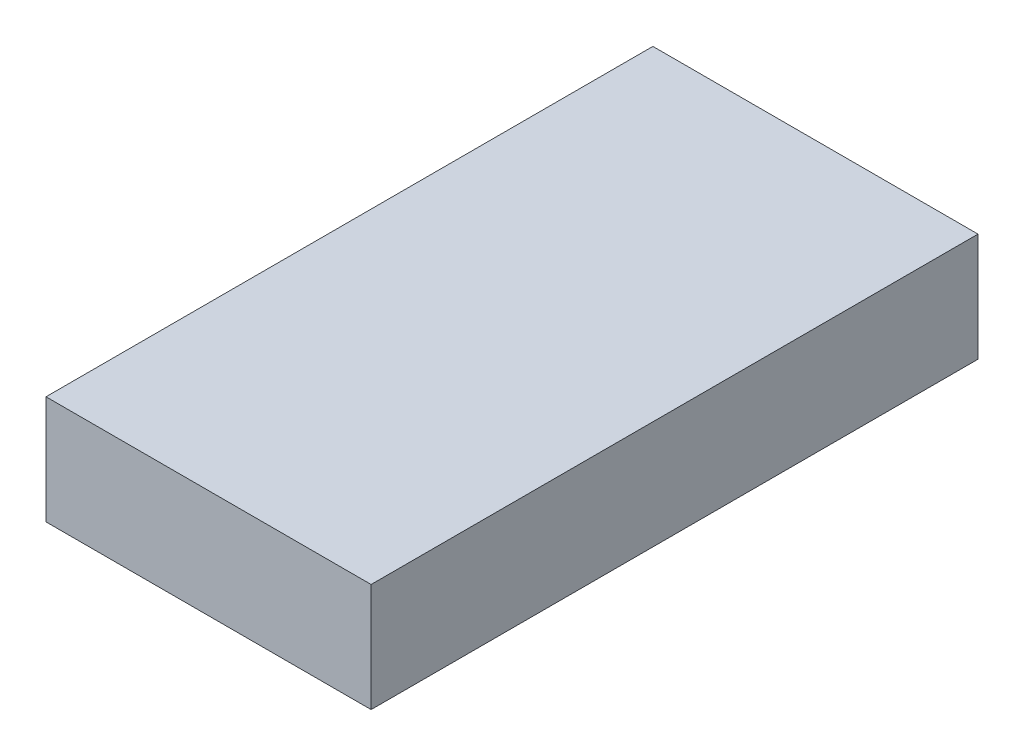
ISO-10303-21;
HEADER;
FILE_DESCRIPTION(('STEP AP214'),'2;1');
FILE_NAME('part.step','',(''),(''),'','','');
FILE_SCHEMA(('AUTOMOTIVE_DESIGN { 1 0 10303 214 1 1 1 1 }'));
ENDSEC;
DATA;
#1=APPLICATION_CONTEXT('core data for automotive mechanical design processes');
#2=APPLICATION_PROTOCOL_DEFINITION('international standard','automotive_design',2000,#1);
#3=PRODUCT_CONTEXT('',#1,'mechanical');
#4=PRODUCT('Part','Part','',(#3));
#5=PRODUCT_RELATED_PRODUCT_CATEGORY('part','',(#4));
#6=PRODUCT_DEFINITION_FORMATION('','',#4);
#7=PRODUCT_DEFINITION_CONTEXT('part definition',#1,'design');
#8=PRODUCT_DEFINITION('design','',#6,#7);
#9=PRODUCT_DEFINITION_SHAPE('','',#8);
#10=(LENGTH_UNIT() NAMED_UNIT(*) SI_UNIT(.MILLI.,.METRE.));
#11=(NAMED_UNIT(*) PLANE_ANGLE_UNIT() SI_UNIT($,.RADIAN.));
#12=(NAMED_UNIT(*) SI_UNIT($,.STERADIAN.) SOLID_ANGLE_UNIT());
#13=UNCERTAINTY_MEASURE_WITH_UNIT(LENGTH_MEASURE(1.E-05),#10,'distance_accuracy_value','');
#14=(GEOMETRIC_REPRESENTATION_CONTEXT(3) GLOBAL_UNCERTAINTY_ASSIGNED_CONTEXT((#13)) GLOBAL_UNIT_ASSIGNED_CONTEXT((#10,
#11,#12)) REPRESENTATION_CONTEXT('',''));
#15=CARTESIAN_POINT('',(0.,0.,0.));
#16=DIRECTION('',(0.,0.,1.));
#17=DIRECTION('',(1.,0.,0.));
#18=AXIS2_PLACEMENT_3D('',#15,#16,#17);
#19=CARTESIAN_POINT('',(15.,0.,50.));
#20=DIRECTION('',(-1.,0.,0.));
#21=DIRECTION('',(0.,0.,1.));
#22=AXIS2_PLACEMENT_3D('',#19,#20,#21);
#23=PLANE('',#22);
#24=DIRECTION('',(0.,0.,-1.));
#25=VECTOR('',#24,1.);
#26=CARTESIAN_POINT('',(15.,-5.00000000000001,50.));
#27=LINE('',#26,#25);
#28=CARTESIAN_POINT('',(15.,-5.00000000000001,53.));
#29=VERTEX_POINT('',#28);
#30=CARTESIAN_POINT('',(15.,-5.00000000000001,-3.));
#31=VERTEX_POINT('',#30);
#32=EDGE_CURVE('E113',#29,#31,#27,.T.);
#33=ORIENTED_EDGE('',*,*,#32,.T.);
#34=DIRECTION('',(0.,-1.,0.));
#35=VECTOR('',#34,1.);
#36=CARTESIAN_POINT('',(15.,4.99999999999999,-3.));
#37=LINE('',#36,#35);
#38=CARTESIAN_POINT('',(15.,4.99999999999999,-3.));
#39=VERTEX_POINT('',#38);
#40=EDGE_CURVE('E401',#39,#31,#37,.T.);
#41=ORIENTED_EDGE('',*,*,#40,.F.);
#42=DIRECTION('',(0.,0.,-1.));
#43=VECTOR('',#42,1.);
#44=CARTESIAN_POINT('',(15.,4.99999999999999,50.));
#45=LINE('',#44,#43);
#46=CARTESIAN_POINT('',(15.,4.99999999999999,53.));
#47=VERTEX_POINT('',#46);
#48=EDGE_CURVE('E11',#47,#39,#45,.T.);
#49=ORIENTED_EDGE('',*,*,#48,.F.);
#50=DIRECTION('',(0.,1.,0.));
#51=VECTOR('',#50,1.);
#52=CARTESIAN_POINT('',(15.,4.99999999999999,53.));
#53=LINE('',#52,#51);
#54=EDGE_CURVE('E413',#29,#47,#53,.T.);
#55=ORIENTED_EDGE('',*,*,#54,.F.);
#56=EDGE_LOOP('',(#33,#41,#49,#55));
#57=FACE_BOUND('',#56,.T.);
#58=ADVANCED_FACE('F38',(#57),#23,.F.);
#59=CARTESIAN_POINT('',(0.,4.99999999999999,50.));
#60=DIRECTION('',(0.,1.,0.));
#61=DIRECTION('',(0.,0.,1.));
#62=AXIS2_PLACEMENT_3D('',#59,#60,#61);
#63=PLANE('',#62);
#64=ORIENTED_EDGE('',*,*,#48,.T.);
#65=DIRECTION('',(1.,0.,0.));
#66=VECTOR('',#65,1.);
#67=CARTESIAN_POINT('',(15.,4.99999999999999,-3.));
#68=LINE('',#67,#66);
#69=CARTESIAN_POINT('',(-15.,4.99999999999999,-3.));
#70=VERTEX_POINT('',#69);
#71=EDGE_CURVE('E130',#70,#39,#68,.T.);
#72=ORIENTED_EDGE('',*,*,#71,.F.);
#73=DIRECTION('',(0.,0.,-1.));
#74=VECTOR('',#73,1.);
#75=CARTESIAN_POINT('',(-15.,4.99999999999999,50.));
#76=LINE('',#75,#74);
#77=CARTESIAN_POINT('',(-15.,4.99999999999999,53.));
#78=VERTEX_POINT('',#77);
#79=EDGE_CURVE('E49',#78,#70,#76,.T.);
#80=ORIENTED_EDGE('',*,*,#79,.F.);
#81=DIRECTION('',(-1.,0.,0.));
#82=VECTOR('',#81,1.);
#83=CARTESIAN_POINT('',(-15.,4.99999999999999,53.));
#84=LINE('',#83,#82);
#85=EDGE_CURVE('E408',#47,#78,#84,.T.);
#86=ORIENTED_EDGE('',*,*,#85,.F.);
#87=EDGE_LOOP('',(#64,#72,#80,#86));
#88=FACE_BOUND('',#87,.T.);
#89=ADVANCED_FACE('F308',(#88),#63,.T.);
#90=CARTESIAN_POINT('',(-15.,0.,50.));
#91=DIRECTION('',(-1.,0.,0.));
#92=DIRECTION('',(0.,0.,1.));
#93=AXIS2_PLACEMENT_3D('',#90,#91,#92);
#94=PLANE('',#93);
#95=ORIENTED_EDGE('',*,*,#79,.T.);
#96=DIRECTION('',(0.,1.,0.));
#97=VECTOR('',#96,1.);
#98=CARTESIAN_POINT('',(-15.,4.99999999999999,-3.));
#99=LINE('',#98,#97);
#100=CARTESIAN_POINT('',(-15.,-5.00000000000001,-3.));
#101=VERTEX_POINT('',#100);
#102=EDGE_CURVE('E410',#101,#70,#99,.T.);
#103=ORIENTED_EDGE('',*,*,#102,.F.);
#104=DIRECTION('',(0.,0.,-1.));
#105=VECTOR('',#104,1.);
#106=CARTESIAN_POINT('',(-15.,-5.00000000000001,50.));
#107=LINE('',#106,#105);
#108=CARTESIAN_POINT('',(-15.,-5.00000000000001,53.));
#109=VERTEX_POINT('',#108);
#110=EDGE_CURVE('E147',#109,#101,#107,.T.);
#111=ORIENTED_EDGE('',*,*,#110,.F.);
#112=DIRECTION('',(0.,-1.,0.));
#113=VECTOR('',#112,1.);
#114=CARTESIAN_POINT('',(-15.,4.99999999999999,53.));
#115=LINE('',#114,#113);
#116=EDGE_CURVE('E430',#78,#109,#115,.T.);
#117=ORIENTED_EDGE('',*,*,#116,.F.);
#118=EDGE_LOOP('',(#95,#103,#111,#117));
#119=FACE_BOUND('',#118,.T.);
#120=ADVANCED_FACE('F299',(#119),#94,.T.);
#121=CARTESIAN_POINT('',(0.,-5.00000000000001,50.));
#122=DIRECTION('',(0.,1.,0.));
#123=DIRECTION('',(0.,0.,1.));
#124=AXIS2_PLACEMENT_3D('',#121,#122,#123);
#125=PLANE('',#124);
#126=ORIENTED_EDGE('',*,*,#110,.T.);
#127=DIRECTION('',(-1.,0.,0.));
#128=VECTOR('',#127,1.);
#129=CARTESIAN_POINT('',(15.,-5.00000000000001,-3.));
#130=LINE('',#129,#128);
#131=EDGE_CURVE('E404',#31,#101,#130,.T.);
#132=ORIENTED_EDGE('',*,*,#131,.F.);
#133=ORIENTED_EDGE('',*,*,#32,.F.);
#134=DIRECTION('',(1.,0.,0.));
#135=VECTOR('',#134,1.);
#136=CARTESIAN_POINT('',(-15.,-5.00000000000001,53.));
#137=LINE('',#136,#135);
#138=EDGE_CURVE('E429',#109,#29,#137,.T.);
#139=ORIENTED_EDGE('',*,*,#138,.F.);
#140=EDGE_LOOP('',(#126,#132,#133,#139));
#141=FACE_BOUND('',#140,.T.);
#142=ADVANCED_FACE('F307',(#141),#125,.F.);
#143=CARTESIAN_POINT('',(0.,0.,-3.));
#144=DIRECTION('',(0.,0.,-1.));
#145=DIRECTION('',(-1.,0.,0.));
#146=AXIS2_PLACEMENT_3D('',#143,#144,#145);
#147=PLANE('',#146);
#148=ORIENTED_EDGE('',*,*,#40,.T.);
#149=ORIENTED_EDGE('',*,*,#131,.T.);
#150=ORIENTED_EDGE('',*,*,#102,.T.);
#151=ORIENTED_EDGE('',*,*,#71,.T.);
#152=EDGE_LOOP('',(#148,#149,#150,#151));
#153=FACE_BOUND('',#152,.T.);
#154=ADVANCED_FACE('F341',(#153),#147,.T.);
#155=CARTESIAN_POINT('',(0.,0.,53.));
#156=DIRECTION('',(0.,0.,1.));
#157=DIRECTION('',(1.,0.,0.));
#158=AXIS2_PLACEMENT_3D('',#155,#156,#157);
#159=PLANE('',#158);
#160=ORIENTED_EDGE('',*,*,#116,.T.);
#161=ORIENTED_EDGE('',*,*,#138,.T.);
#162=ORIENTED_EDGE('',*,*,#54,.T.);
#163=ORIENTED_EDGE('',*,*,#85,.T.);
#164=EDGE_LOOP('',(#160,#161,#162,#163));
#165=FACE_BOUND('',#164,.T.);
#166=ADVANCED_FACE('F353',(#165),#159,.T.);
#167=CLOSED_SHELL('',(#58,#89,#120,#142,#154,#166));
#168=CARTESIAN_POINT('',(0.,0.,0.));
#169=DIRECTION('',(0.,0.,-1.));
#170=DIRECTION('',(-1.,0.,0.));
#171=AXIS2_PLACEMENT_3D('',#168,#169,#170);
#172=PLANE('',#171);
#173=DIRECTION('',(1.,0.,0.));
#174=VECTOR('',#173,1.);
#175=CARTESIAN_POINT('',(0.,2.99999999999999,0.));
#176=LINE('',#175,#174);
#177=CARTESIAN_POINT('',(1.5,2.99999999999999,0.));
#178=VERTEX_POINT('',#177);
#179=CARTESIAN_POINT('',(13.,2.99999999999999,0.));
#180=VERTEX_POINT('',#179);
#181=EDGE_CURVE('E129',#178,#180,#176,.T.);
#182=ORIENTED_EDGE('',*,*,#181,.F.);
#183=DIRECTION('',(0.,-1.,0.));
#184=VECTOR('',#183,1.);
#185=CARTESIAN_POINT('',(1.5,0.,0.));
#186=LINE('',#185,#184);
#187=CARTESIAN_POINT('',(1.5,-3.00000000000001,0.));
#188=VERTEX_POINT('',#187);
#189=EDGE_CURVE('E79',#178,#188,#186,.T.);
#190=ORIENTED_EDGE('',*,*,#189,.T.);
#191=DIRECTION('',(1.,0.,0.));
#192=VECTOR('',#191,1.);
#193=CARTESIAN_POINT('',(0.,-3.00000000000001,0.));
#194=LINE('',#193,#192);
#195=CARTESIAN_POINT('',(13.,-3.00000000000001,0.));
#196=VERTEX_POINT('',#195);
#197=EDGE_CURVE('E134',#188,#196,#194,.T.);
#198=ORIENTED_EDGE('',*,*,#197,.T.);
#199=DIRECTION('',(0.,1.,0.));
#200=VECTOR('',#199,1.);
#201=CARTESIAN_POINT('',(13.,0.,0.));
#202=LINE('',#201,#200);
#203=EDGE_CURVE('E71',#196,#180,#202,.T.);
#204=ORIENTED_EDGE('',*,*,#203,.T.);
#205=EDGE_LOOP('',(#182,#190,#198,#204));
#206=FACE_BOUND('',#205,.T.);
#207=ADVANCED_FACE('F181',(#206),#172,.F.);
#208=CARTESIAN_POINT('',(0.,-3.00000000000001,50.));
#209=DIRECTION('',(0.,1.,0.));
#210=DIRECTION('',(0.,0.,1.));
#211=AXIS2_PLACEMENT_3D('',#208,#209,#210);
#212=PLANE('',#211);
#213=ORIENTED_EDGE('',*,*,#197,.F.);
#214=DIRECTION('',(0.,0.,-1.));
#215=VECTOR('',#214,1.);
#216=CARTESIAN_POINT('',(1.5,-3.00000000000001,50.));
#217=LINE('',#216,#215);
#218=CARTESIAN_POINT('',(1.5,-3.00000000000001,50.));
#219=VERTEX_POINT('',#218);
#220=EDGE_CURVE('E127',#219,#188,#217,.T.);
#221=ORIENTED_EDGE('',*,*,#220,.F.);
#222=DIRECTION('',(1.,0.,0.));
#223=VECTOR('',#222,1.);
#224=CARTESIAN_POINT('',(0.,-3.00000000000001,50.));
#225=LINE('',#224,#223);
#226=CARTESIAN_POINT('',(13.,-3.00000000000001,50.));
#227=VERTEX_POINT('',#226);
#228=EDGE_CURVE('E118',#219,#227,#225,.T.);
#229=ORIENTED_EDGE('',*,*,#228,.T.);
#230=DIRECTION('',(0.,0.,-1.));
#231=VECTOR('',#230,1.);
#232=CARTESIAN_POINT('',(13.,-3.00000000000001,50.));
#233=LINE('',#232,#231);
#234=EDGE_CURVE('E157',#227,#196,#233,.T.);
#235=ORIENTED_EDGE('',*,*,#234,.T.);
#236=EDGE_LOOP('',(#213,#221,#229,#235));
#237=FACE_BOUND('',#236,.T.);
#238=ADVANCED_FACE('F179',(#237),#212,.T.);
#239=CARTESIAN_POINT('',(13.,0.,50.));
#240=DIRECTION('',(-1.,0.,0.));
#241=DIRECTION('',(0.,-1.,0.));
#242=AXIS2_PLACEMENT_3D('',#239,#240,#241);
#243=PLANE('',#242);
#244=ORIENTED_EDGE('',*,*,#203,.F.);
#245=ORIENTED_EDGE('',*,*,#234,.F.);
#246=DIRECTION('',(0.,1.,0.));
#247=VECTOR('',#246,1.);
#248=CARTESIAN_POINT('',(13.,0.,50.));
#249=LINE('',#248,#247);
#250=CARTESIAN_POINT('',(13.,2.99999999999999,50.));
#251=VERTEX_POINT('',#250);
#252=EDGE_CURVE('E121',#227,#251,#249,.T.);
#253=ORIENTED_EDGE('',*,*,#252,.T.);
#254=DIRECTION('',(0.,0.,-1.));
#255=VECTOR('',#254,1.);
#256=CARTESIAN_POINT('',(13.,2.99999999999999,50.));
#257=LINE('',#256,#255);
#258=EDGE_CURVE('E159',#251,#180,#257,.T.);
#259=ORIENTED_EDGE('',*,*,#258,.T.);
#260=EDGE_LOOP('',(#244,#245,#253,#259));
#261=FACE_BOUND('',#260,.T.);
#262=ADVANCED_FACE('F190',(#261),#243,.T.);
#263=CARTESIAN_POINT('',(0.,2.99999999999999,50.));
#264=DIRECTION('',(0.,1.,0.));
#265=DIRECTION('',(-1.,0.,0.));
#266=AXIS2_PLACEMENT_3D('',#263,#264,#265);
#267=PLANE('',#266);
#268=ORIENTED_EDGE('',*,*,#181,.T.);
#269=ORIENTED_EDGE('',*,*,#258,.F.);
#270=DIRECTION('',(1.,0.,0.));
#271=VECTOR('',#270,1.);
#272=CARTESIAN_POINT('',(0.,2.99999999999999,50.));
#273=LINE('',#272,#271);
#274=CARTESIAN_POINT('',(1.5,2.99999999999999,50.));
#275=VERTEX_POINT('',#274);
#276=EDGE_CURVE('E170',#275,#251,#273,.T.);
#277=ORIENTED_EDGE('',*,*,#276,.F.);
#278=DIRECTION('',(0.,0.,-1.));
#279=VECTOR('',#278,1.);
#280=CARTESIAN_POINT('',(1.5,2.99999999999999,50.));
#281=LINE('',#280,#279);
#282=EDGE_CURVE('E42',#275,#178,#281,.T.);
#283=ORIENTED_EDGE('',*,*,#282,.T.);
#284=EDGE_LOOP('',(#268,#269,#277,#283));
#285=FACE_BOUND('',#284,.T.);
#286=ADVANCED_FACE('F167',(#285),#267,.F.);
#287=CARTESIAN_POINT('',(1.5,0.,50.));
#288=DIRECTION('',(1.,0.,0.));
#289=DIRECTION('',(0.,0.,-1.));
#290=AXIS2_PLACEMENT_3D('',#287,#288,#289);
#291=PLANE('',#290);
#292=ORIENTED_EDGE('',*,*,#189,.F.);
#293=ORIENTED_EDGE('',*,*,#282,.F.);
#294=DIRECTION('',(0.,-1.,0.));
#295=VECTOR('',#294,1.);
#296=CARTESIAN_POINT('',(1.5,0.,50.));
#297=LINE('',#296,#295);
#298=EDGE_CURVE('E144',#275,#219,#297,.T.);
#299=ORIENTED_EDGE('',*,*,#298,.T.);
#300=ORIENTED_EDGE('',*,*,#220,.T.);
#301=EDGE_LOOP('',(#292,#293,#299,#300));
#302=FACE_BOUND('',#301,.T.);
#303=ADVANCED_FACE('F40',(#302),#291,.T.);
#304=CARTESIAN_POINT('',(0.,0.,50.));
#305=DIRECTION('',(0.,0.,1.));
#306=DIRECTION('',(1.,0.,0.));
#307=AXIS2_PLACEMENT_3D('',#304,#305,#306);
#308=PLANE('',#307);
#309=ORIENTED_EDGE('',*,*,#298,.F.);
#310=ORIENTED_EDGE('',*,*,#276,.T.);
#311=ORIENTED_EDGE('',*,*,#252,.F.);
#312=ORIENTED_EDGE('',*,*,#228,.F.);
#313=EDGE_LOOP('',(#309,#310,#311,#312));
#314=FACE_BOUND('',#313,.T.);
#315=ADVANCED_FACE('F202',(#314),#308,.F.);
#316=CLOSED_SHELL('',(#207,#238,#262,#286,#303,#315));
#317=DIRECTION('',(0.,1.,0.));
#318=VECTOR('',#317,1.);
#319=CARTESIAN_POINT('',(-13.,0.,50.));
#320=LINE('',#319,#318);
#321=CARTESIAN_POINT('',(-13.,-3.00000000000001,50.));
#322=VERTEX_POINT('',#321);
#323=CARTESIAN_POINT('',(-13.,2.99999999999999,50.));
#324=VERTEX_POINT('',#323);
#325=EDGE_CURVE('E117',#322,#324,#320,.T.);
#326=ORIENTED_EDGE('',*,*,#325,.T.);
#327=DIRECTION('',(1.,0.,0.));
#328=VECTOR('',#327,1.);
#329=CARTESIAN_POINT('',(0.,2.99999999999999,50.));
#330=LINE('',#329,#328);
#331=CARTESIAN_POINT('',(-1.5,2.99999999999999,50.));
#332=VERTEX_POINT('',#331);
#333=EDGE_CURVE('E103',#324,#332,#330,.T.);
#334=ORIENTED_EDGE('',*,*,#333,.T.);
#335=DIRECTION('',(0.,-1.,0.));
#336=VECTOR('',#335,1.);
#337=CARTESIAN_POINT('',(-1.5,0.,50.));
#338=LINE('',#337,#336);
#339=CARTESIAN_POINT('',(-1.5,-3.00000000000001,50.));
#340=VERTEX_POINT('',#339);
#341=EDGE_CURVE('E90',#332,#340,#338,.T.);
#342=ORIENTED_EDGE('',*,*,#341,.T.);
#343=DIRECTION('',(1.,0.,0.));
#344=VECTOR('',#343,1.);
#345=CARTESIAN_POINT('',(0.,-3.00000000000001,50.));
#346=LINE('',#345,#344);
#347=EDGE_CURVE('E102',#322,#340,#346,.T.);
#348=ORIENTED_EDGE('',*,*,#347,.F.);
#349=EDGE_LOOP('',(#326,#334,#342,#348));
#350=FACE_BOUND('',#349,.T.);
#351=ADVANCED_FACE('F116',(#350),#308,.F.);
#352=DIRECTION('',(1.,0.,0.));
#353=VECTOR('',#352,1.);
#354=CARTESIAN_POINT('',(0.,2.99999999999999,0.));
#355=LINE('',#354,#353);
#356=CARTESIAN_POINT('',(-13.,2.99999999999999,0.));
#357=VERTEX_POINT('',#356);
#358=CARTESIAN_POINT('',(-1.5,2.99999999999999,0.));
#359=VERTEX_POINT('',#358);
#360=EDGE_CURVE('E112',#357,#359,#355,.T.);
#361=ORIENTED_EDGE('',*,*,#360,.F.);
#362=DIRECTION('',(0.,1.,0.));
#363=VECTOR('',#362,1.);
#364=CARTESIAN_POINT('',(-13.,0.,0.));
#365=LINE('',#364,#363);
#366=CARTESIAN_POINT('',(-13.,-3.00000000000001,0.));
#367=VERTEX_POINT('',#366);
#368=EDGE_CURVE('E141',#367,#357,#365,.T.);
#369=ORIENTED_EDGE('',*,*,#368,.F.);
#370=DIRECTION('',(1.,0.,0.));
#371=VECTOR('',#370,1.);
#372=CARTESIAN_POINT('',(0.,-3.00000000000001,0.));
#373=LINE('',#372,#371);
#374=CARTESIAN_POINT('',(-1.5,-3.00000000000001,0.));
#375=VERTEX_POINT('',#374);
#376=EDGE_CURVE('E139',#367,#375,#373,.T.);
#377=ORIENTED_EDGE('',*,*,#376,.T.);
#378=DIRECTION('',(0.,-1.,0.));
#379=VECTOR('',#378,1.);
#380=CARTESIAN_POINT('',(-1.5,0.,0.));
#381=LINE('',#380,#379);
#382=EDGE_CURVE('E137',#359,#375,#381,.T.);
#383=ORIENTED_EDGE('',*,*,#382,.F.);
#384=EDGE_LOOP('',(#361,#369,#377,#383));
#385=FACE_BOUND('',#384,.T.);
#386=ADVANCED_FACE('F184',(#385),#172,.F.);
#387=CARTESIAN_POINT('',(-13.,0.,50.));
#388=DIRECTION('',(-1.,0.,0.));
#389=DIRECTION('',(0.,0.,1.));
#390=AXIS2_PLACEMENT_3D('',#387,#388,#389);
#391=PLANE('',#390);
#392=ORIENTED_EDGE('',*,*,#368,.T.);
#393=DIRECTION('',(0.,0.,-1.));
#394=VECTOR('',#393,1.);
#395=CARTESIAN_POINT('',(-13.,2.99999999999999,50.));
#396=LINE('',#395,#394);
#397=EDGE_CURVE('E152',#324,#357,#396,.T.);
#398=ORIENTED_EDGE('',*,*,#397,.F.);
#399=ORIENTED_EDGE('',*,*,#325,.F.);
#400=DIRECTION('',(0.,0.,-1.));
#401=VECTOR('',#400,1.);
#402=CARTESIAN_POINT('',(-13.,-3.00000000000001,50.));
#403=LINE('',#402,#401);
#404=EDGE_CURVE('E58',#322,#367,#403,.T.);
#405=ORIENTED_EDGE('',*,*,#404,.T.);
#406=EDGE_LOOP('',(#392,#398,#399,#405));
#407=FACE_BOUND('',#406,.T.);
#408=ADVANCED_FACE('F196',(#407),#391,.F.);
#409=CARTESIAN_POINT('',(0.,-3.00000000000001,50.));
#410=DIRECTION('',(0.,1.,0.));
#411=DIRECTION('',(0.,0.,1.));
#412=AXIS2_PLACEMENT_3D('',#409,#410,#411);
#413=PLANE('',#412);
#414=ORIENTED_EDGE('',*,*,#376,.F.);
#415=ORIENTED_EDGE('',*,*,#404,.F.);
#416=ORIENTED_EDGE('',*,*,#347,.T.);
#417=DIRECTION('',(0.,0.,-1.));
#418=VECTOR('',#417,1.);
#419=CARTESIAN_POINT('',(-1.5,-3.00000000000001,50.));
#420=LINE('',#419,#418);
#421=EDGE_CURVE('E98',#340,#375,#420,.T.);
#422=ORIENTED_EDGE('',*,*,#421,.T.);
#423=EDGE_LOOP('',(#414,#415,#416,#422));
#424=FACE_BOUND('',#423,.T.);
#425=ADVANCED_FACE('F236',(#424),#413,.T.);
#426=CARTESIAN_POINT('',(-1.5,0.,50.));
#427=DIRECTION('',(1.,0.,0.));
#428=DIRECTION('',(0.,0.,-1.));
#429=AXIS2_PLACEMENT_3D('',#426,#427,#428);
#430=PLANE('',#429);
#431=ORIENTED_EDGE('',*,*,#382,.T.);
#432=ORIENTED_EDGE('',*,*,#421,.F.);
#433=ORIENTED_EDGE('',*,*,#341,.F.);
#434=DIRECTION('',(0.,0.,-1.));
#435=VECTOR('',#434,1.);
#436=CARTESIAN_POINT('',(-1.5,2.99999999999999,50.));
#437=LINE('',#436,#435);
#438=EDGE_CURVE('E95',#332,#359,#437,.T.);
#439=ORIENTED_EDGE('',*,*,#438,.T.);
#440=EDGE_LOOP('',(#431,#432,#433,#439));
#441=FACE_BOUND('',#440,.T.);
#442=ADVANCED_FACE('F93',(#441),#430,.F.);
#443=CARTESIAN_POINT('',(0.,2.99999999999999,50.));
#444=DIRECTION('',(0.,1.,0.));
#445=DIRECTION('',(0.,0.,1.));
#446=AXIS2_PLACEMENT_3D('',#443,#444,#445);
#447=PLANE('',#446);
#448=ORIENTED_EDGE('',*,*,#360,.T.);
#449=ORIENTED_EDGE('',*,*,#438,.F.);
#450=ORIENTED_EDGE('',*,*,#333,.F.);
#451=ORIENTED_EDGE('',*,*,#397,.T.);
#452=EDGE_LOOP('',(#448,#449,#450,#451));
#453=FACE_BOUND('',#452,.T.);
#454=ADVANCED_FACE('F107',(#453),#447,.F.);
#455=CLOSED_SHELL('',(#351,#386,#408,#425,#442,#454));
#456=ORIENTED_CLOSED_SHELL('',*,#316,.T.);
#457=ORIENTED_CLOSED_SHELL('',*,#455,.T.);
#458=BREP_WITH_VOIDS('B2',#167,(#456,#457));
#459=ADVANCED_BREP_SHAPE_REPRESENTATION('',(#18,#458),#14);
#460=SHAPE_DEFINITION_REPRESENTATION(#9,#459);
ENDSEC;
END-ISO-10303-21;
